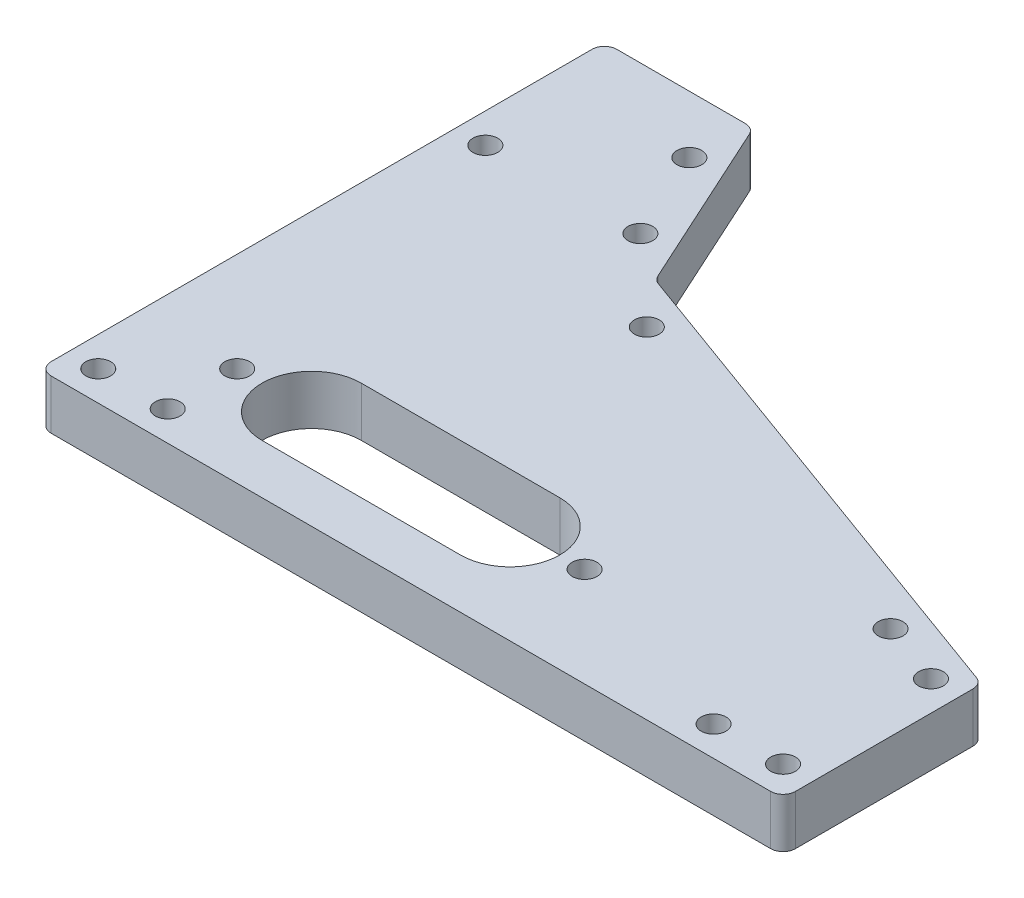
ISO-10303-21;
HEADER;
FILE_DESCRIPTION(('STEP AP214'),'2;1');
FILE_NAME('part.step','',(''),(''),'','','');
FILE_SCHEMA(('AUTOMOTIVE_DESIGN { 1 0 10303 214 1 1 1 1 }'));
ENDSEC;
DATA;
#1=APPLICATION_CONTEXT('core data for automotive mechanical design processes');
#2=APPLICATION_PROTOCOL_DEFINITION('international standard','automotive_design',2000,#1);
#3=PRODUCT_CONTEXT('',#1,'mechanical');
#4=PRODUCT('Part','Part','',(#3));
#5=PRODUCT_RELATED_PRODUCT_CATEGORY('part','',(#4));
#6=PRODUCT_DEFINITION_FORMATION('','',#4);
#7=PRODUCT_DEFINITION_CONTEXT('part definition',#1,'design');
#8=PRODUCT_DEFINITION('design','',#6,#7);
#9=PRODUCT_DEFINITION_SHAPE('','',#8);
#10=(LENGTH_UNIT() NAMED_UNIT(*) SI_UNIT(.MILLI.,.METRE.));
#11=(NAMED_UNIT(*) PLANE_ANGLE_UNIT() SI_UNIT($,.RADIAN.));
#12=(NAMED_UNIT(*) SI_UNIT($,.STERADIAN.) SOLID_ANGLE_UNIT());
#13=UNCERTAINTY_MEASURE_WITH_UNIT(LENGTH_MEASURE(1.E-05),#10,'distance_accuracy_value','');
#14=(GEOMETRIC_REPRESENTATION_CONTEXT(3) GLOBAL_UNCERTAINTY_ASSIGNED_CONTEXT((#13)) GLOBAL_UNIT_ASSIGNED_CONTEXT((#10,
#11,#12)) REPRESENTATION_CONTEXT('',''));
#15=CARTESIAN_POINT('',(0.,0.,0.));
#16=DIRECTION('',(0.,0.,1.));
#17=DIRECTION('',(1.,0.,0.));
#18=AXIS2_PLACEMENT_3D('',#15,#16,#17);
#19=CARTESIAN_POINT('',(0.,12.7,0.));
#20=DIRECTION('',(0.,-1.,0.));
#21=DIRECTION('',(0.,0.,-1.));
#22=AXIS2_PLACEMENT_3D('',#19,#20,#21);
#23=PLANE('',#22);
#24=CARTESIAN_POINT('',(165.1,12.7,-7.62));
#25=DIRECTION('',(0.,1.,0.));
#26=DIRECTION('',(0.,0.,1.));
#27=AXIS2_PLACEMENT_3D('',#24,#25,#26);
#28=CIRCLE('',#27,3.175);
#29=CARTESIAN_POINT('',(165.1,12.7,-4.445));
#30=VERTEX_POINT('',#29);
#31=EDGE_CURVE('E217',#30,#30,#28,.T.);
#32=ORIENTED_EDGE('',*,*,#31,.F.);
#33=EDGE_LOOP('',(#32));
#34=FACE_BOUND('',#33,.T.);
#35=CARTESIAN_POINT('',(25.4,12.7,-7.61999999999996));
#36=DIRECTION('',(0.,1.,0.));
#37=DIRECTION('',(0.,0.,1.));
#38=AXIS2_PLACEMENT_3D('',#35,#36,#37);
#39=CIRCLE('',#38,3.175);
#40=CARTESIAN_POINT('',(25.4,12.7,-4.44499999999996));
#41=VERTEX_POINT('',#40);
#42=EDGE_CURVE('E225',#41,#41,#39,.T.);
#43=ORIENTED_EDGE('',*,*,#42,.F.);
#44=EDGE_LOOP('',(#43));
#45=FACE_BOUND('',#44,.T.);
#46=CARTESIAN_POINT('',(7.62,12.7,-7.61999999999998));
#47=DIRECTION('',(0.,1.,0.));
#48=DIRECTION('',(0.,0.,1.));
#49=AXIS2_PLACEMENT_3D('',#46,#47,#48);
#50=CIRCLE('',#49,3.175);
#51=CARTESIAN_POINT('',(7.62,12.7,-4.44499999999998));
#52=VERTEX_POINT('',#51);
#53=EDGE_CURVE('E233',#52,#52,#50,.T.);
#54=ORIENTED_EDGE('',*,*,#53,.F.);
#55=EDGE_LOOP('',(#54));
#56=FACE_BOUND('',#55,.T.);
#57=CARTESIAN_POINT('',(7.62,12.7,-106.679530824651));
#58=DIRECTION('',(0.,1.,0.));
#59=DIRECTION('',(0.,0.,1.));
#60=AXIS2_PLACEMENT_3D('',#57,#58,#59);
#61=CIRCLE('',#60,3.175);
#62=CARTESIAN_POINT('',(7.62,12.7,-103.504530824651));
#63=VERTEX_POINT('',#62);
#64=EDGE_CURVE('E241',#63,#63,#61,.T.);
#65=ORIENTED_EDGE('',*,*,#64,.F.);
#66=EDGE_LOOP('',(#65));
#67=FACE_BOUND('',#66,.T.);
#68=CARTESIAN_POINT('',(182.88,12.7,-7.62));
#69=DIRECTION('',(0.,1.,0.));
#70=DIRECTION('',(0.,0.,1.));
#71=AXIS2_PLACEMENT_3D('',#68,#69,#70);
#72=CIRCLE('',#71,3.175);
#73=CARTESIAN_POINT('',(182.88,12.7,-4.445));
#74=VERTEX_POINT('',#73);
#75=EDGE_CURVE('E249',#74,#74,#72,.T.);
#76=ORIENTED_EDGE('',*,*,#75,.F.);
#77=EDGE_LOOP('',(#76));
#78=FACE_BOUND('',#77,.T.);
#79=CARTESIAN_POINT('',(47.013808136848,12.7,-106.961302091678));
#80=DIRECTION('',(0.,1.,0.));
#81=DIRECTION('',(0.,0.,1.));
#82=AXIS2_PLACEMENT_3D('',#79,#80,#81);
#83=CIRCLE('',#82,3.175);
#84=CARTESIAN_POINT('',(47.013808136848,12.7,-103.786302091678));
#85=VERTEX_POINT('',#84);
#86=EDGE_CURVE('E257',#85,#85,#83,.T.);
#87=ORIENTED_EDGE('',*,*,#86,.F.);
#88=EDGE_LOOP('',(#87));
#89=FACE_BOUND('',#88,.T.);
#90=CARTESIAN_POINT('',(68.552843668048,12.7,-87.0761004319709));
#91=DIRECTION('',(0.,1.,0.));
#92=DIRECTION('',(0.,0.,1.));
#93=AXIS2_PLACEMENT_3D('',#90,#91,#92);
#94=CIRCLE('',#93,3.175);
#95=CARTESIAN_POINT('',(68.552843668048,12.7,-83.9011004319709));
#96=VERTEX_POINT('',#95);
#97=EDGE_CURVE('E265',#96,#96,#94,.T.);
#98=ORIENTED_EDGE('',*,*,#97,.F.);
#99=EDGE_LOOP('',(#98));
#100=FACE_BOUND('',#99,.T.);
#101=CARTESIAN_POINT('',(182.88,12.7,-45.464418558842));
#102=DIRECTION('',(0.,1.,0.));
#103=DIRECTION('',(0.,0.,1.));
#104=AXIS2_PLACEMENT_3D('',#101,#102,#103);
#105=CIRCLE('',#104,3.175);
#106=CARTESIAN_POINT('',(182.88,12.7,-42.289418558842));
#107=VERTEX_POINT('',#106);
#108=EDGE_CURVE('E273',#107,#107,#105,.T.);
#109=ORIENTED_EDGE('',*,*,#108,.F.);
#110=EDGE_LOOP('',(#109));
#111=FACE_BOUND('',#110,.T.);
#112=CARTESIAN_POINT('',(36.4513376987438,12.7,-130.060960492706));
#113=DIRECTION('',(0.,1.,0.));
#114=DIRECTION('',(0.,0.,1.));
#115=AXIS2_PLACEMENT_3D('',#112,#113,#114);
#116=CIRCLE('',#115,3.175);
#117=CARTESIAN_POINT('',(36.4513376987438,12.7,-126.885960492706));
#118=VERTEX_POINT('',#117);
#119=EDGE_CURVE('E281',#118,#118,#116,.T.);
#120=ORIENTED_EDGE('',*,*,#119,.F.);
#121=EDGE_LOOP('',(#120));
#122=FACE_BOUND('',#121,.T.);
#123=CARTESIAN_POINT('',(166.631807432038,12.7,-51.3782770142055));
#124=DIRECTION('',(0.,1.,0.));
#125=DIRECTION('',(0.,0.,1.));
#126=AXIS2_PLACEMENT_3D('',#123,#124,#125);
#127=CIRCLE('',#126,3.175);
#128=CARTESIAN_POINT('',(166.631807432038,12.7,-48.2032770142055));
#129=VERTEX_POINT('',#128);
#130=EDGE_CURVE('E289',#129,#129,#127,.T.);
#131=ORIENTED_EDGE('',*,*,#130,.F.);
#132=EDGE_LOOP('',(#131));
#133=FACE_BOUND('',#132,.T.);
#134=DIRECTION('',(0.,0.,1.));
#135=VECTOR('',#134,1.);
#136=CARTESIAN_POINT('',(0.,12.7,0.));
#137=LINE('',#136,#135);
#138=CARTESIAN_POINT('',(0.,12.7,-141.604530824651));
#139=VERTEX_POINT('',#138);
#140=CARTESIAN_POINT('',(0.,12.7,-3.175));
#141=VERTEX_POINT('',#140);
#142=EDGE_CURVE('E297',#139,#141,#137,.T.);
#143=ORIENTED_EDGE('',*,*,#142,.T.);
#144=CARTESIAN_POINT('',(3.17500000000001,12.7,-3.175));
#145=DIRECTION('',(0.,-1.,0.));
#146=DIRECTION('',(0.,0.,-1.));
#147=AXIS2_PLACEMENT_3D('',#144,#145,#146);
#148=CIRCLE('',#147,3.175);
#149=CARTESIAN_POINT('',(3.17500000000001,12.7,0.));
#150=VERTEX_POINT('',#149);
#151=EDGE_CURVE('E381',#141,#150,#148,.F.);
#152=ORIENTED_EDGE('',*,*,#151,.T.);
#153=DIRECTION('',(1.,0.,0.));
#154=VECTOR('',#153,1.);
#155=CARTESIAN_POINT('',(190.5,12.7,0.));
#156=LINE('',#155,#154);
#157=CARTESIAN_POINT('',(187.325,12.7,0.));
#158=VERTEX_POINT('',#157);
#159=EDGE_CURVE('E301',#150,#158,#156,.T.);
#160=ORIENTED_EDGE('',*,*,#159,.T.);
#161=CARTESIAN_POINT('',(187.325,12.7,-3.175));
#162=DIRECTION('',(0.,-1.,0.));
#163=DIRECTION('',(0.,0.,-1.));
#164=AXIS2_PLACEMENT_3D('',#161,#162,#163);
#165=CIRCLE('',#164,3.175);
#166=CARTESIAN_POINT('',(190.5,12.7,-3.175));
#167=VERTEX_POINT('',#166);
#168=EDGE_CURVE('E378',#158,#167,#165,.F.);
#169=ORIENTED_EDGE('',*,*,#168,.T.);
#170=DIRECTION('',(0.,0.,-1.));
#171=VECTOR('',#170,1.);
#172=CARTESIAN_POINT('',(190.5,12.7,-50.8));
#173=LINE('',#172,#171);
#174=CARTESIAN_POINT('',(190.5,12.7,-48.5768410661842));
#175=VERTEX_POINT('',#174);
#176=EDGE_CURVE('E306',#167,#175,#173,.T.);
#177=ORIENTED_EDGE('',*,*,#176,.T.);
#178=CARTESIAN_POINT('',(187.325,12.7,-48.5768410661842));
#179=DIRECTION('',(0.,-1.,0.));
#180=DIRECTION('',(0.,0.,-1.));
#181=AXIS2_PLACEMENT_3D('',#178,#179,#180);
#182=CIRCLE('',#181,3.175);
#183=CARTESIAN_POINT('',(188.410913955059,12.7,-51.5603651371794));
#184=VERTEX_POINT('',#183);
#185=EDGE_CURVE('E375',#175,#184,#182,.F.);
#186=ORIENTED_EDGE('',*,*,#185,.T.);
#187=DIRECTION('',(-0.93969262078591,0.,-0.342020143325665));
#188=VECTOR('',#187,1.);
#189=CARTESIAN_POINT('',(59.2249408762084,12.7,-98.5802140225955));
#190=LINE('',#189,#188);
#191=CARTESIAN_POINT('',(60.4738155630558,12.7,-98.1256608102545));
#192=VERTEX_POINT('',#191);
#193=EDGE_CURVE('E310',#184,#192,#190,.T.);
#194=ORIENTED_EDGE('',*,*,#193,.T.);
#195=CARTESIAN_POINT('',(61.5597295181148,12.7,-101.10918488125));
#196=DIRECTION('',(0.,-1.,0.));
#197=DIRECTION('',(0.,0.,-1.));
#198=AXIS2_PLACEMENT_3D('',#195,#196,#197);
#199=CIRCLE('',#198,3.175);
#200=CARTESIAN_POINT('',(58.6722722179863,12.7,-99.7888760764867));
#201=VERTEX_POINT('',#200);
#202=EDGE_CURVE('E11',#192,#201,#199,.T.);
#203=ORIENTED_EDGE('',*,*,#202,.T.);
#204=DIRECTION('',(-0.415845292838749,0.,-0.909435370119205));
#205=VECTOR('',#204,1.);
#206=CARTESIAN_POINT('',(38.1,12.7,-144.779530824651));
#207=LINE('',#206,#205);
#208=CARTESIAN_POINT('',(38.9480697238636,12.7,-142.924839629414));
#209=VERTEX_POINT('',#208);
#210=EDGE_CURVE('E314',#201,#209,#207,.T.);
#211=ORIENTED_EDGE('',*,*,#210,.T.);
#212=CARTESIAN_POINT('',(36.0606124237351,12.7,-141.604530824651));
#213=DIRECTION('',(0.,-1.,0.));
#214=DIRECTION('',(0.,0.,-1.));
#215=AXIS2_PLACEMENT_3D('',#212,#213,#214);
#216=CIRCLE('',#215,3.175);
#217=CARTESIAN_POINT('',(36.0606124237351,12.7,-144.779530824651));
#218=VERTEX_POINT('',#217);
#219=EDGE_CURVE('E68',#209,#218,#216,.F.);
#220=ORIENTED_EDGE('',*,*,#219,.T.);
#221=DIRECTION('',(-1.,0.,0.));
#222=VECTOR('',#221,1.);
#223=CARTESIAN_POINT('',(0.,12.7,-144.779530824651));
#224=LINE('',#223,#222);
#225=CARTESIAN_POINT('',(3.175,12.7,-144.779530824651));
#226=VERTEX_POINT('',#225);
#227=EDGE_CURVE('E317',#218,#226,#224,.T.);
#228=ORIENTED_EDGE('',*,*,#227,.T.);
#229=CARTESIAN_POINT('',(3.175,12.7,-141.604530824651));
#230=DIRECTION('',(0.,-1.,0.));
#231=DIRECTION('',(0.,0.,-1.));
#232=AXIS2_PLACEMENT_3D('',#229,#230,#231);
#233=CIRCLE('',#232,3.175);
#234=EDGE_CURVE('E370',#226,#139,#233,.F.);
#235=ORIENTED_EDGE('',*,*,#234,.T.);
#236=EDGE_LOOP('',(#143,#152,#160,#169,#177,#186,#194,#203,#211,#220,#228,#235));
#237=FACE_BOUND('',#236,.T.);
#238=CARTESIAN_POINT('',(95.25,12.7,-25.4));
#239=DIRECTION('',(0.,1.,0.));
#240=DIRECTION('',(0.,0.,1.));
#241=AXIS2_PLACEMENT_3D('',#238,#239,#240);
#242=CIRCLE('',#241,12.7);
#243=CARTESIAN_POINT('',(95.25,12.7,-12.7));
#244=VERTEX_POINT('',#243);
#245=CARTESIAN_POINT('',(95.25,12.7,-38.1));
#246=VERTEX_POINT('',#245);
#247=EDGE_CURVE('E161',#244,#246,#242,.T.);
#248=ORIENTED_EDGE('',*,*,#247,.F.);
#249=DIRECTION('',(1.,0.,0.));
#250=VECTOR('',#249,1.);
#251=CARTESIAN_POINT('',(95.25,12.7,-12.7));
#252=LINE('',#251,#250);
#253=CARTESIAN_POINT('',(44.45,12.7,-12.7));
#254=VERTEX_POINT('',#253);
#255=EDGE_CURVE('E191',#254,#244,#252,.T.);
#256=ORIENTED_EDGE('',*,*,#255,.F.);
#257=CARTESIAN_POINT('',(44.45,12.7,-25.4));
#258=DIRECTION('',(0.,1.,0.));
#259=DIRECTION('',(0.,0.,1.));
#260=AXIS2_PLACEMENT_3D('',#257,#258,#259);
#261=CIRCLE('',#260,12.7);
#262=CARTESIAN_POINT('',(44.45,12.7,-38.1));
#263=VERTEX_POINT('',#262);
#264=EDGE_CURVE('E187',#263,#254,#261,.T.);
#265=ORIENTED_EDGE('',*,*,#264,.F.);
#266=DIRECTION('',(-1.,0.,0.));
#267=VECTOR('',#266,1.);
#268=CARTESIAN_POINT('',(95.25,12.7,-38.1));
#269=LINE('',#268,#267);
#270=EDGE_CURVE('E172',#246,#263,#269,.T.);
#271=ORIENTED_EDGE('',*,*,#270,.F.);
#272=EDGE_LOOP('',(#248,#256,#265,#271));
#273=FACE_BOUND('',#272,.T.);
#274=CARTESIAN_POINT('',(25.4,12.7,-25.4));
#275=DIRECTION('',(0.,1.,0.));
#276=DIRECTION('',(0.,0.,1.));
#277=AXIS2_PLACEMENT_3D('',#274,#275,#276);
#278=CIRCLE('',#277,3.175);
#279=CARTESIAN_POINT('',(25.4,12.7,-22.225));
#280=VERTEX_POINT('',#279);
#281=EDGE_CURVE('E200',#280,#280,#278,.T.);
#282=ORIENTED_EDGE('',*,*,#281,.F.);
#283=EDGE_LOOP('',(#282));
#284=FACE_BOUND('',#283,.T.);
#285=CARTESIAN_POINT('',(114.3,12.7,-25.4));
#286=DIRECTION('',(0.,1.,0.));
#287=DIRECTION('',(0.,0.,1.));
#288=AXIS2_PLACEMENT_3D('',#285,#286,#287);
#289=CIRCLE('',#288,3.175);
#290=CARTESIAN_POINT('',(114.3,12.7,-22.225));
#291=VERTEX_POINT('',#290);
#292=EDGE_CURVE('E581',#291,#291,#289,.T.);
#293=ORIENTED_EDGE('',*,*,#292,.F.);
#294=EDGE_LOOP('',(#293));
#295=FACE_BOUND('',#294,.T.);
#296=ADVANCED_FACE('F45',(#34,#45,#56,#67,#78,#89,#100,#111,#122,#133,#237,#273,#284,#295),#23,.F.);
#297=CARTESIAN_POINT('',(0.,0.,0.));
#298=DIRECTION('',(0.,-1.,0.));
#299=DIRECTION('',(0.,0.,-1.));
#300=AXIS2_PLACEMENT_3D('',#297,#298,#299);
#301=PLANE('',#300);
#302=CARTESIAN_POINT('',(25.4,0.,-25.4));
#303=DIRECTION('',(0.,1.,0.));
#304=DIRECTION('',(0.,0.,1.));
#305=AXIS2_PLACEMENT_3D('',#302,#303,#304);
#306=CIRCLE('',#305,3.175);
#307=CARTESIAN_POINT('',(25.4,0.,-22.225));
#308=VERTEX_POINT('',#307);
#309=EDGE_CURVE('E584',#308,#308,#306,.T.);
#310=ORIENTED_EDGE('',*,*,#309,.T.);
#311=EDGE_LOOP('',(#310));
#312=FACE_BOUND('',#311,.T.);
#313=CARTESIAN_POINT('',(25.4,0.,-7.61999999999996));
#314=DIRECTION('',(0.,1.,0.));
#315=DIRECTION('',(0.,0.,1.));
#316=AXIS2_PLACEMENT_3D('',#313,#314,#315);
#317=CIRCLE('',#316,3.175);
#318=CARTESIAN_POINT('',(25.4,0.,-4.44499999999996));
#319=VERTEX_POINT('',#318);
#320=EDGE_CURVE('E221',#319,#319,#317,.T.);
#321=ORIENTED_EDGE('',*,*,#320,.T.);
#322=EDGE_LOOP('',(#321));
#323=FACE_BOUND('',#322,.T.);
#324=CARTESIAN_POINT('',(7.62,0.,-106.679530824651));
#325=DIRECTION('',(0.,1.,0.));
#326=DIRECTION('',(0.,0.,1.));
#327=AXIS2_PLACEMENT_3D('',#324,#325,#326);
#328=CIRCLE('',#327,3.175);
#329=CARTESIAN_POINT('',(7.62,0.,-103.504530824651));
#330=VERTEX_POINT('',#329);
#331=EDGE_CURVE('E237',#330,#330,#328,.T.);
#332=ORIENTED_EDGE('',*,*,#331,.T.);
#333=EDGE_LOOP('',(#332));
#334=FACE_BOUND('',#333,.T.);
#335=CARTESIAN_POINT('',(47.013808136848,0.,-106.961302091678));
#336=DIRECTION('',(0.,1.,0.));
#337=DIRECTION('',(0.,0.,1.));
#338=AXIS2_PLACEMENT_3D('',#335,#336,#337);
#339=CIRCLE('',#338,3.175);
#340=CARTESIAN_POINT('',(47.013808136848,0.,-103.786302091678));
#341=VERTEX_POINT('',#340);
#342=EDGE_CURVE('E253',#341,#341,#339,.T.);
#343=ORIENTED_EDGE('',*,*,#342,.T.);
#344=EDGE_LOOP('',(#343));
#345=FACE_BOUND('',#344,.T.);
#346=CARTESIAN_POINT('',(182.88,0.,-45.464418558842));
#347=DIRECTION('',(0.,1.,0.));
#348=DIRECTION('',(0.,0.,1.));
#349=AXIS2_PLACEMENT_3D('',#346,#347,#348);
#350=CIRCLE('',#349,3.175);
#351=CARTESIAN_POINT('',(182.88,0.,-42.289418558842));
#352=VERTEX_POINT('',#351);
#353=EDGE_CURVE('E269',#352,#352,#350,.T.);
#354=ORIENTED_EDGE('',*,*,#353,.T.);
#355=EDGE_LOOP('',(#354));
#356=FACE_BOUND('',#355,.T.);
#357=CARTESIAN_POINT('',(166.631807432038,0.,-51.3782770142055));
#358=DIRECTION('',(0.,1.,0.));
#359=DIRECTION('',(0.,0.,1.));
#360=AXIS2_PLACEMENT_3D('',#357,#358,#359);
#361=CIRCLE('',#360,3.175);
#362=CARTESIAN_POINT('',(166.631807432038,0.,-48.2032770142055));
#363=VERTEX_POINT('',#362);
#364=EDGE_CURVE('E285',#363,#363,#361,.T.);
#365=ORIENTED_EDGE('',*,*,#364,.T.);
#366=EDGE_LOOP('',(#365));
#367=FACE_BOUND('',#366,.T.);
#368=DIRECTION('',(1.,0.,0.));
#369=VECTOR('',#368,1.);
#370=CARTESIAN_POINT('',(190.5,0.,0.));
#371=LINE('',#370,#369);
#372=CARTESIAN_POINT('',(3.17500000000001,0.,0.));
#373=VERTEX_POINT('',#372);
#374=CARTESIAN_POINT('',(187.325,0.,0.));
#375=VERTEX_POINT('',#374);
#376=EDGE_CURVE('E324',#373,#375,#371,.T.);
#377=ORIENTED_EDGE('',*,*,#376,.F.);
#378=CARTESIAN_POINT('',(3.17500000000001,0.,-3.175));
#379=DIRECTION('',(0.,-1.,0.));
#380=DIRECTION('',(0.,0.,-1.));
#381=AXIS2_PLACEMENT_3D('',#378,#379,#380);
#382=CIRCLE('',#381,3.175);
#383=CARTESIAN_POINT('',(0.,0.,-3.175));
#384=VERTEX_POINT('',#383);
#385=EDGE_CURVE('E360',#373,#384,#382,.T.);
#386=ORIENTED_EDGE('',*,*,#385,.T.);
#387=DIRECTION('',(0.,0.,1.));
#388=VECTOR('',#387,1.);
#389=CARTESIAN_POINT('',(0.,0.,0.));
#390=LINE('',#389,#388);
#391=CARTESIAN_POINT('',(0.,0.,-141.604530824651));
#392=VERTEX_POINT('',#391);
#393=EDGE_CURVE('E293',#392,#384,#390,.T.);
#394=ORIENTED_EDGE('',*,*,#393,.F.);
#395=CARTESIAN_POINT('',(3.175,0.,-141.604530824651));
#396=DIRECTION('',(0.,-1.,0.));
#397=DIRECTION('',(0.,0.,-1.));
#398=AXIS2_PLACEMENT_3D('',#395,#396,#397);
#399=CIRCLE('',#398,3.175);
#400=CARTESIAN_POINT('',(3.175,0.,-144.779530824651));
#401=VERTEX_POINT('',#400);
#402=EDGE_CURVE('E348',#392,#401,#399,.T.);
#403=ORIENTED_EDGE('',*,*,#402,.T.);
#404=DIRECTION('',(-1.,0.,0.));
#405=VECTOR('',#404,1.);
#406=CARTESIAN_POINT('',(0.,0.,-144.779530824651));
#407=LINE('',#406,#405);
#408=CARTESIAN_POINT('',(36.0606124237351,0.,-144.779530824651));
#409=VERTEX_POINT('',#408);
#410=EDGE_CURVE('E302',#409,#401,#407,.T.);
#411=ORIENTED_EDGE('',*,*,#410,.F.);
#412=CARTESIAN_POINT('',(36.0606124237351,0.,-141.604530824651));
#413=DIRECTION('',(0.,-1.,0.));
#414=DIRECTION('',(0.,0.,-1.));
#415=AXIS2_PLACEMENT_3D('',#412,#413,#414);
#416=CIRCLE('',#415,3.175);
#417=CARTESIAN_POINT('',(38.9480697238636,0.,-142.924839629414));
#418=VERTEX_POINT('',#417);
#419=EDGE_CURVE('E351',#409,#418,#416,.T.);
#420=ORIENTED_EDGE('',*,*,#419,.T.);
#421=DIRECTION('',(-0.415845292838749,0.,-0.909435370119205));
#422=VECTOR('',#421,1.);
#423=CARTESIAN_POINT('',(38.1,0.,-144.779530824651));
#424=LINE('',#423,#422);
#425=CARTESIAN_POINT('',(58.6722722179863,0.,-99.7888760764867));
#426=VERTEX_POINT('',#425);
#427=EDGE_CURVE('E336',#426,#418,#424,.T.);
#428=ORIENTED_EDGE('',*,*,#427,.F.);
#429=CARTESIAN_POINT('',(61.5597295181148,0.,-101.10918488125));
#430=DIRECTION('',(0.,-1.,0.));
#431=DIRECTION('',(0.,0.,-1.));
#432=AXIS2_PLACEMENT_3D('',#429,#430,#431);
#433=CIRCLE('',#432,3.175);
#434=CARTESIAN_POINT('',(60.4738155630558,0.,-98.1256608102545));
#435=VERTEX_POINT('',#434);
#436=EDGE_CURVE('E54',#426,#435,#433,.F.);
#437=ORIENTED_EDGE('',*,*,#436,.T.);
#438=DIRECTION('',(-0.93969262078591,0.,-0.342020143325665));
#439=VECTOR('',#438,1.);
#440=CARTESIAN_POINT('',(59.2249408762084,0.,-98.5802140225955));
#441=LINE('',#440,#439);
#442=CARTESIAN_POINT('',(188.410913955059,0.,-51.5603651371794));
#443=VERTEX_POINT('',#442);
#444=EDGE_CURVE('E332',#443,#435,#441,.T.);
#445=ORIENTED_EDGE('',*,*,#444,.F.);
#446=CARTESIAN_POINT('',(187.325,0.,-48.5768410661842));
#447=DIRECTION('',(0.,-1.,0.));
#448=DIRECTION('',(0.,0.,-1.));
#449=AXIS2_PLACEMENT_3D('',#446,#447,#448);
#450=CIRCLE('',#449,3.175);
#451=CARTESIAN_POINT('',(190.5,0.,-48.5768410661842));
#452=VERTEX_POINT('',#451);
#453=EDGE_CURVE('E354',#443,#452,#450,.T.);
#454=ORIENTED_EDGE('',*,*,#453,.T.);
#455=DIRECTION('',(0.,0.,-1.));
#456=VECTOR('',#455,1.);
#457=CARTESIAN_POINT('',(190.5,0.,-50.8));
#458=LINE('',#457,#456);
#459=CARTESIAN_POINT('',(190.5,0.,-3.175));
#460=VERTEX_POINT('',#459);
#461=EDGE_CURVE('E328',#460,#452,#458,.T.);
#462=ORIENTED_EDGE('',*,*,#461,.F.);
#463=CARTESIAN_POINT('',(187.325,0.,-3.175));
#464=DIRECTION('',(0.,-1.,0.));
#465=DIRECTION('',(0.,0.,-1.));
#466=AXIS2_PLACEMENT_3D('',#463,#464,#465);
#467=CIRCLE('',#466,3.175);
#468=EDGE_CURVE('E357',#460,#375,#467,.T.);
#469=ORIENTED_EDGE('',*,*,#468,.T.);
#470=EDGE_LOOP('',(#377,#386,#394,#403,#411,#420,#428,#437,#445,#454,#462,#469));
#471=FACE_BOUND('',#470,.T.);
#472=CARTESIAN_POINT('',(36.4513376987438,0.,-130.060960492706));
#473=DIRECTION('',(0.,1.,0.));
#474=DIRECTION('',(0.,0.,1.));
#475=AXIS2_PLACEMENT_3D('',#472,#473,#474);
#476=CIRCLE('',#475,3.175);
#477=CARTESIAN_POINT('',(36.4513376987438,0.,-126.885960492706));
#478=VERTEX_POINT('',#477);
#479=EDGE_CURVE('E277',#478,#478,#476,.T.);
#480=ORIENTED_EDGE('',*,*,#479,.T.);
#481=EDGE_LOOP('',(#480));
#482=FACE_BOUND('',#481,.T.);
#483=CARTESIAN_POINT('',(68.552843668048,0.,-87.0761004319709));
#484=DIRECTION('',(0.,1.,0.));
#485=DIRECTION('',(0.,0.,1.));
#486=AXIS2_PLACEMENT_3D('',#483,#484,#485);
#487=CIRCLE('',#486,3.175);
#488=CARTESIAN_POINT('',(68.552843668048,0.,-83.9011004319709));
#489=VERTEX_POINT('',#488);
#490=EDGE_CURVE('E261',#489,#489,#487,.T.);
#491=ORIENTED_EDGE('',*,*,#490,.T.);
#492=EDGE_LOOP('',(#491));
#493=FACE_BOUND('',#492,.T.);
#494=CARTESIAN_POINT('',(182.88,0.,-7.62));
#495=DIRECTION('',(0.,1.,0.));
#496=DIRECTION('',(0.,0.,1.));
#497=AXIS2_PLACEMENT_3D('',#494,#495,#496);
#498=CIRCLE('',#497,3.175);
#499=CARTESIAN_POINT('',(182.88,0.,-4.445));
#500=VERTEX_POINT('',#499);
#501=EDGE_CURVE('E245',#500,#500,#498,.T.);
#502=ORIENTED_EDGE('',*,*,#501,.T.);
#503=EDGE_LOOP('',(#502));
#504=FACE_BOUND('',#503,.T.);
#505=CARTESIAN_POINT('',(7.62,0.,-7.61999999999998));
#506=DIRECTION('',(0.,1.,0.));
#507=DIRECTION('',(0.,0.,1.));
#508=AXIS2_PLACEMENT_3D('',#505,#506,#507);
#509=CIRCLE('',#508,3.175);
#510=CARTESIAN_POINT('',(7.62,0.,-4.44499999999998));
#511=VERTEX_POINT('',#510);
#512=EDGE_CURVE('E229',#511,#511,#509,.T.);
#513=ORIENTED_EDGE('',*,*,#512,.T.);
#514=EDGE_LOOP('',(#513));
#515=FACE_BOUND('',#514,.T.);
#516=CARTESIAN_POINT('',(165.1,0.,-7.62));
#517=DIRECTION('',(0.,1.,0.));
#518=DIRECTION('',(0.,0.,1.));
#519=AXIS2_PLACEMENT_3D('',#516,#517,#518);
#520=CIRCLE('',#519,3.175);
#521=CARTESIAN_POINT('',(165.1,0.,-4.445));
#522=VERTEX_POINT('',#521);
#523=EDGE_CURVE('E181',#522,#522,#520,.T.);
#524=ORIENTED_EDGE('',*,*,#523,.T.);
#525=EDGE_LOOP('',(#524));
#526=FACE_BOUND('',#525,.T.);
#527=DIRECTION('',(1.,0.,0.));
#528=VECTOR('',#527,1.);
#529=CARTESIAN_POINT('',(95.25,0.,-12.7));
#530=LINE('',#529,#528);
#531=CARTESIAN_POINT('',(44.45,0.,-12.7));
#532=VERTEX_POINT('',#531);
#533=CARTESIAN_POINT('',(95.25,0.,-12.7));
#534=VERTEX_POINT('',#533);
#535=EDGE_CURVE('E173',#532,#534,#530,.T.);
#536=ORIENTED_EDGE('',*,*,#535,.T.);
#537=CARTESIAN_POINT('',(95.25,0.,-25.4));
#538=DIRECTION('',(0.,1.,0.));
#539=DIRECTION('',(0.,0.,1.));
#540=AXIS2_PLACEMENT_3D('',#537,#538,#539);
#541=CIRCLE('',#540,12.7);
#542=CARTESIAN_POINT('',(95.25,0.,-38.1));
#543=VERTEX_POINT('',#542);
#544=EDGE_CURVE('E197',#534,#543,#541,.T.);
#545=ORIENTED_EDGE('',*,*,#544,.T.);
#546=DIRECTION('',(-1.,0.,0.));
#547=VECTOR('',#546,1.);
#548=CARTESIAN_POINT('',(95.25,0.,-38.1));
#549=LINE('',#548,#547);
#550=CARTESIAN_POINT('',(44.45,0.,-38.1));
#551=VERTEX_POINT('',#550);
#552=EDGE_CURVE('E179',#543,#551,#549,.T.);
#553=ORIENTED_EDGE('',*,*,#552,.T.);
#554=CARTESIAN_POINT('',(44.45,0.,-25.4));
#555=DIRECTION('',(0.,1.,0.));
#556=DIRECTION('',(0.,0.,1.));
#557=AXIS2_PLACEMENT_3D('',#554,#555,#556);
#558=CIRCLE('',#557,12.7);
#559=EDGE_CURVE('E203',#551,#532,#558,.T.);
#560=ORIENTED_EDGE('',*,*,#559,.T.);
#561=EDGE_LOOP('',(#536,#545,#553,#560));
#562=FACE_BOUND('',#561,.T.);
#563=CARTESIAN_POINT('',(114.3,0.,-25.4));
#564=DIRECTION('',(0.,1.,0.));
#565=DIRECTION('',(0.,0.,1.));
#566=AXIS2_PLACEMENT_3D('',#563,#564,#565);
#567=CIRCLE('',#566,3.175);
#568=CARTESIAN_POINT('',(114.3,0.,-22.225));
#569=VERTEX_POINT('',#568);
#570=EDGE_CURVE('E579',#569,#569,#567,.T.);
#571=ORIENTED_EDGE('',*,*,#570,.T.);
#572=EDGE_LOOP('',(#571));
#573=FACE_BOUND('',#572,.T.);
#574=ADVANCED_FACE('F415',(#312,#323,#334,#345,#356,#367,#471,#482,#493,#504,#515,#526,#562,
#573),#301,.T.);
#575=CARTESIAN_POINT('',(0.,12.7,0.));
#576=DIRECTION('',(1.,0.,0.));
#577=DIRECTION('',(0.,0.,-1.));
#578=AXIS2_PLACEMENT_3D('',#575,#576,#577);
#579=PLANE('',#578);
#580=ORIENTED_EDGE('',*,*,#393,.T.);
#581=DIRECTION('',(0.,-1.,0.));
#582=VECTOR('',#581,1.);
#583=CARTESIAN_POINT('',(0.,12.7,-3.175));
#584=LINE('',#583,#582);
#585=EDGE_CURVE('E367',#384,#141,#584,.F.);
#586=ORIENTED_EDGE('',*,*,#585,.T.);
#587=ORIENTED_EDGE('',*,*,#142,.F.);
#588=DIRECTION('',(0.,-1.,0.));
#589=VECTOR('',#588,1.);
#590=CARTESIAN_POINT('',(0.,12.7,-141.604530824651));
#591=LINE('',#590,#589);
#592=EDGE_CURVE('E363',#139,#392,#591,.T.);
#593=ORIENTED_EDGE('',*,*,#592,.T.);
#594=EDGE_LOOP('',(#580,#586,#587,#593));
#595=FACE_BOUND('',#594,.T.);
#596=ADVANCED_FACE('F441',(#595),#579,.F.);
#597=CARTESIAN_POINT('',(190.5,12.7,0.));
#598=DIRECTION('',(0.,0.,-1.));
#599=DIRECTION('',(-1.,0.,0.));
#600=AXIS2_PLACEMENT_3D('',#597,#598,#599);
#601=PLANE('',#600);
#602=ORIENTED_EDGE('',*,*,#159,.F.);
#603=DIRECTION('',(0.,-1.,0.));
#604=VECTOR('',#603,1.);
#605=CARTESIAN_POINT('',(3.17500000000001,12.7,0.));
#606=LINE('',#605,#604);
#607=EDGE_CURVE('E344',#150,#373,#606,.T.);
#608=ORIENTED_EDGE('',*,*,#607,.T.);
#609=ORIENTED_EDGE('',*,*,#376,.T.);
#610=DIRECTION('',(0.,-1.,0.));
#611=VECTOR('',#610,1.);
#612=CARTESIAN_POINT('',(187.325,12.7,0.));
#613=LINE('',#612,#611);
#614=EDGE_CURVE('E320',#375,#158,#613,.F.);
#615=ORIENTED_EDGE('',*,*,#614,.T.);
#616=EDGE_LOOP('',(#602,#608,#609,#615));
#617=FACE_BOUND('',#616,.T.);
#618=ADVANCED_FACE('F449',(#617),#601,.F.);
#619=CARTESIAN_POINT('',(190.5,12.7,-50.8));
#620=DIRECTION('',(-1.,0.,0.));
#621=DIRECTION('',(0.,0.,1.));
#622=AXIS2_PLACEMENT_3D('',#619,#620,#621);
#623=PLANE('',#622);
#624=ORIENTED_EDGE('',*,*,#176,.F.);
#625=DIRECTION('',(0.,-1.,0.));
#626=VECTOR('',#625,1.);
#627=CARTESIAN_POINT('',(190.5,12.7,-3.175));
#628=LINE('',#627,#626);
#629=EDGE_CURVE('E387',#167,#460,#628,.T.);
#630=ORIENTED_EDGE('',*,*,#629,.T.);
#631=ORIENTED_EDGE('',*,*,#461,.T.);
#632=DIRECTION('',(0.,-1.,0.));
#633=VECTOR('',#632,1.);
#634=CARTESIAN_POINT('',(190.5,12.7,-48.5768410661842));
#635=LINE('',#634,#633);
#636=EDGE_CURVE('E384',#452,#175,#635,.F.);
#637=ORIENTED_EDGE('',*,*,#636,.T.);
#638=EDGE_LOOP('',(#624,#630,#631,#637));
#639=FACE_BOUND('',#638,.T.);
#640=ADVANCED_FACE('F458',(#639),#623,.F.);
#641=CARTESIAN_POINT('',(59.2249408762084,12.7,-98.5802140225955));
#642=DIRECTION('',(-0.342020143325665,0.,0.939692620785909));
#643=DIRECTION('',(0.93969262078591,0.,0.342020143325665));
#644=AXIS2_PLACEMENT_3D('',#641,#642,#643);
#645=PLANE('',#644);
#646=ORIENTED_EDGE('',*,*,#193,.F.);
#647=DIRECTION('',(0.,-1.,0.));
#648=VECTOR('',#647,1.);
#649=CARTESIAN_POINT('',(188.410913955059,12.7,-51.5603651371794));
#650=LINE('',#649,#648);
#651=EDGE_CURVE('E394',#184,#443,#650,.T.);
#652=ORIENTED_EDGE('',*,*,#651,.T.);
#653=ORIENTED_EDGE('',*,*,#444,.T.);
#654=DIRECTION('',(0.,-1.,0.));
#655=VECTOR('',#654,1.);
#656=CARTESIAN_POINT('',(60.4738155630558,12.7,-98.1256608102545));
#657=LINE('',#656,#655);
#658=EDGE_CURVE('E391',#435,#192,#657,.F.);
#659=ORIENTED_EDGE('',*,*,#658,.T.);
#660=EDGE_LOOP('',(#646,#652,#653,#659));
#661=FACE_BOUND('',#660,.T.);
#662=ADVANCED_FACE('F422',(#661),#645,.F.);
#663=CARTESIAN_POINT('',(38.1,12.7,-144.779530824651));
#664=DIRECTION('',(-0.909435370119205,0.,0.415845292838749));
#665=DIRECTION('',(0.415845292838749,0.,0.909435370119205));
#666=AXIS2_PLACEMENT_3D('',#663,#664,#665);
#667=PLANE('',#666);
#668=ORIENTED_EDGE('',*,*,#210,.F.);
#669=DIRECTION('',(0.,-1.,0.));
#670=VECTOR('',#669,1.);
#671=CARTESIAN_POINT('',(58.6722722179863,0.,-99.7888760764867));
#672=LINE('',#671,#670);
#673=EDGE_CURVE('E401',#201,#426,#672,.T.);
#674=ORIENTED_EDGE('',*,*,#673,.T.);
#675=ORIENTED_EDGE('',*,*,#427,.T.);
#676=DIRECTION('',(0.,-1.,0.));
#677=VECTOR('',#676,1.);
#678=CARTESIAN_POINT('',(38.9480697238636,12.7,-142.924839629414));
#679=LINE('',#678,#677);
#680=EDGE_CURVE('E398',#418,#209,#679,.F.);
#681=ORIENTED_EDGE('',*,*,#680,.T.);
#682=EDGE_LOOP('',(#668,#674,#675,#681));
#683=FACE_BOUND('',#682,.T.);
#684=ADVANCED_FACE('F428',(#683),#667,.F.);
#685=CARTESIAN_POINT('',(0.,12.7,-144.779530824651));
#686=DIRECTION('',(0.,0.,1.));
#687=DIRECTION('',(1.,0.,0.));
#688=AXIS2_PLACEMENT_3D('',#685,#686,#687);
#689=PLANE('',#688);
#690=ORIENTED_EDGE('',*,*,#227,.F.);
#691=DIRECTION('',(0.,-1.,0.));
#692=VECTOR('',#691,1.);
#693=CARTESIAN_POINT('',(36.0606124237351,12.7,-144.779530824651));
#694=LINE('',#693,#692);
#695=EDGE_CURVE('E407',#218,#409,#694,.T.);
#696=ORIENTED_EDGE('',*,*,#695,.T.);
#697=ORIENTED_EDGE('',*,*,#410,.T.);
#698=DIRECTION('',(0.,-1.,0.));
#699=VECTOR('',#698,1.);
#700=CARTESIAN_POINT('',(3.175,12.7,-144.779530824651));
#701=LINE('',#700,#699);
#702=EDGE_CURVE('E61',#401,#226,#701,.F.);
#703=ORIENTED_EDGE('',*,*,#702,.T.);
#704=EDGE_LOOP('',(#690,#696,#697,#703));
#705=FACE_BOUND('',#704,.T.);
#706=ADVANCED_FACE('F434',(#705),#689,.F.);
#707=CARTESIAN_POINT('',(166.631807432038,12.7,-51.3782770142055));
#708=DIRECTION('',(0.,-1.,0.));
#709=DIRECTION('',(0.,0.,-1.));
#710=AXIS2_PLACEMENT_3D('',#707,#708,#709);
#711=CYLINDRICAL_SURFACE('',#710,3.175);
#712=ORIENTED_EDGE('',*,*,#130,.T.);
#713=EDGE_LOOP('',(#712));
#714=FACE_BOUND('',#713,.T.);
#715=ORIENTED_EDGE('',*,*,#364,.F.);
#716=EDGE_LOOP('',(#715));
#717=FACE_BOUND('',#716,.T.);
#718=ADVANCED_FACE('F483',(#714,#717),#711,.F.);
#719=CARTESIAN_POINT('',(36.4513376987438,12.7,-130.060960492706));
#720=DIRECTION('',(0.,-1.,0.));
#721=DIRECTION('',(0.,0.,-1.));
#722=AXIS2_PLACEMENT_3D('',#719,#720,#721);
#723=CYLINDRICAL_SURFACE('',#722,3.175);
#724=ORIENTED_EDGE('',*,*,#119,.T.);
#725=EDGE_LOOP('',(#724));
#726=FACE_BOUND('',#725,.T.);
#727=ORIENTED_EDGE('',*,*,#479,.F.);
#728=EDGE_LOOP('',(#727));
#729=FACE_BOUND('',#728,.T.);
#730=ADVANCED_FACE('F555',(#726,#729),#723,.F.);
#731=CARTESIAN_POINT('',(182.88,12.7,-45.464418558842));
#732=DIRECTION('',(0.,-1.,0.));
#733=DIRECTION('',(0.,0.,-1.));
#734=AXIS2_PLACEMENT_3D('',#731,#732,#733);
#735=CYLINDRICAL_SURFACE('',#734,3.175);
#736=ORIENTED_EDGE('',*,*,#108,.T.);
#737=EDGE_LOOP('',(#736));
#738=FACE_BOUND('',#737,.T.);
#739=ORIENTED_EDGE('',*,*,#353,.F.);
#740=EDGE_LOOP('',(#739));
#741=FACE_BOUND('',#740,.T.);
#742=ADVANCED_FACE('F552',(#738,#741),#735,.F.);
#743=CARTESIAN_POINT('',(68.552843668048,12.7,-87.0761004319709));
#744=DIRECTION('',(0.,-1.,0.));
#745=DIRECTION('',(0.,0.,-1.));
#746=AXIS2_PLACEMENT_3D('',#743,#744,#745);
#747=CYLINDRICAL_SURFACE('',#746,3.175);
#748=ORIENTED_EDGE('',*,*,#97,.T.);
#749=EDGE_LOOP('',(#748));
#750=FACE_BOUND('',#749,.T.);
#751=ORIENTED_EDGE('',*,*,#490,.F.);
#752=EDGE_LOOP('',(#751));
#753=FACE_BOUND('',#752,.T.);
#754=ADVANCED_FACE('F548',(#750,#753),#747,.F.);
#755=CARTESIAN_POINT('',(47.013808136848,12.7,-106.961302091678));
#756=DIRECTION('',(0.,-1.,0.));
#757=DIRECTION('',(0.,0.,-1.));
#758=AXIS2_PLACEMENT_3D('',#755,#756,#757);
#759=CYLINDRICAL_SURFACE('',#758,3.175);
#760=ORIENTED_EDGE('',*,*,#86,.T.);
#761=EDGE_LOOP('',(#760));
#762=FACE_BOUND('',#761,.T.);
#763=ORIENTED_EDGE('',*,*,#342,.F.);
#764=EDGE_LOOP('',(#763));
#765=FACE_BOUND('',#764,.T.);
#766=ADVANCED_FACE('F544',(#762,#765),#759,.F.);
#767=CARTESIAN_POINT('',(182.88,12.7,-7.62));
#768=DIRECTION('',(0.,-1.,0.));
#769=DIRECTION('',(0.,0.,-1.));
#770=AXIS2_PLACEMENT_3D('',#767,#768,#769);
#771=CYLINDRICAL_SURFACE('',#770,3.175);
#772=ORIENTED_EDGE('',*,*,#75,.T.);
#773=EDGE_LOOP('',(#772));
#774=FACE_BOUND('',#773,.T.);
#775=ORIENTED_EDGE('',*,*,#501,.F.);
#776=EDGE_LOOP('',(#775));
#777=FACE_BOUND('',#776,.T.);
#778=ADVANCED_FACE('F540',(#774,#777),#771,.F.);
#779=CARTESIAN_POINT('',(7.62,12.7,-106.679530824651));
#780=DIRECTION('',(0.,-1.,0.));
#781=DIRECTION('',(0.,0.,-1.));
#782=AXIS2_PLACEMENT_3D('',#779,#780,#781);
#783=CYLINDRICAL_SURFACE('',#782,3.175);
#784=ORIENTED_EDGE('',*,*,#64,.T.);
#785=EDGE_LOOP('',(#784));
#786=FACE_BOUND('',#785,.T.);
#787=ORIENTED_EDGE('',*,*,#331,.F.);
#788=EDGE_LOOP('',(#787));
#789=FACE_BOUND('',#788,.T.);
#790=ADVANCED_FACE('F536',(#786,#789),#783,.F.);
#791=CARTESIAN_POINT('',(7.62,12.7,-7.61999999999998));
#792=DIRECTION('',(0.,-1.,0.));
#793=DIRECTION('',(0.,0.,-1.));
#794=AXIS2_PLACEMENT_3D('',#791,#792,#793);
#795=CYLINDRICAL_SURFACE('',#794,3.175);
#796=ORIENTED_EDGE('',*,*,#53,.T.);
#797=EDGE_LOOP('',(#796));
#798=FACE_BOUND('',#797,.T.);
#799=ORIENTED_EDGE('',*,*,#512,.F.);
#800=EDGE_LOOP('',(#799));
#801=FACE_BOUND('',#800,.T.);
#802=ADVANCED_FACE('F532',(#798,#801),#795,.F.);
#803=CARTESIAN_POINT('',(25.4,12.7,-7.61999999999996));
#804=DIRECTION('',(0.,-1.,0.));
#805=DIRECTION('',(0.,0.,-1.));
#806=AXIS2_PLACEMENT_3D('',#803,#804,#805);
#807=CYLINDRICAL_SURFACE('',#806,3.175);
#808=ORIENTED_EDGE('',*,*,#42,.T.);
#809=EDGE_LOOP('',(#808));
#810=FACE_BOUND('',#809,.T.);
#811=ORIENTED_EDGE('',*,*,#320,.F.);
#812=EDGE_LOOP('',(#811));
#813=FACE_BOUND('',#812,.T.);
#814=ADVANCED_FACE('F528',(#810,#813),#807,.F.);
#815=CARTESIAN_POINT('',(165.1,12.7,-7.62));
#816=DIRECTION('',(0.,-1.,0.));
#817=DIRECTION('',(0.,0.,-1.));
#818=AXIS2_PLACEMENT_3D('',#815,#816,#817);
#819=CYLINDRICAL_SURFACE('',#818,3.175);
#820=ORIENTED_EDGE('',*,*,#31,.T.);
#821=EDGE_LOOP('',(#820));
#822=FACE_BOUND('',#821,.T.);
#823=ORIENTED_EDGE('',*,*,#523,.F.);
#824=EDGE_LOOP('',(#823));
#825=FACE_BOUND('',#824,.T.);
#826=ADVANCED_FACE('F525',(#822,#825),#819,.F.);
#827=CARTESIAN_POINT('',(95.25,12.7,-25.4));
#828=DIRECTION('',(0.,-1.,0.));
#829=DIRECTION('',(0.,0.,-1.));
#830=AXIS2_PLACEMENT_3D('',#827,#828,#829);
#831=CYLINDRICAL_SURFACE('',#830,12.7);
#832=ORIENTED_EDGE('',*,*,#544,.F.);
#833=DIRECTION('',(0.,-1.,0.));
#834=VECTOR('',#833,1.);
#835=CARTESIAN_POINT('',(95.25,12.7,-12.7));
#836=LINE('',#835,#834);
#837=EDGE_CURVE('E167',#244,#534,#836,.T.);
#838=ORIENTED_EDGE('',*,*,#837,.F.);
#839=ORIENTED_EDGE('',*,*,#247,.T.);
#840=DIRECTION('',(0.,-1.,0.));
#841=VECTOR('',#840,1.);
#842=CARTESIAN_POINT('',(95.25,12.7,-38.1));
#843=LINE('',#842,#841);
#844=EDGE_CURVE('E164',#246,#543,#843,.T.);
#845=ORIENTED_EDGE('',*,*,#844,.T.);
#846=EDGE_LOOP('',(#832,#838,#839,#845));
#847=FACE_BOUND('',#846,.T.);
#848=ADVANCED_FACE('F163',(#847),#831,.F.);
#849=CARTESIAN_POINT('',(95.25,12.7,-38.1));
#850=DIRECTION('',(0.,0.,1.));
#851=DIRECTION('',(1.,0.,0.));
#852=AXIS2_PLACEMENT_3D('',#849,#850,#851);
#853=PLANE('',#852);
#854=ORIENTED_EDGE('',*,*,#552,.F.);
#855=ORIENTED_EDGE('',*,*,#844,.F.);
#856=ORIENTED_EDGE('',*,*,#270,.T.);
#857=DIRECTION('',(0.,-1.,0.));
#858=VECTOR('',#857,1.);
#859=CARTESIAN_POINT('',(44.45,12.7,-38.1));
#860=LINE('',#859,#858);
#861=EDGE_CURVE('E182',#263,#551,#860,.T.);
#862=ORIENTED_EDGE('',*,*,#861,.T.);
#863=EDGE_LOOP('',(#854,#855,#856,#862));
#864=FACE_BOUND('',#863,.T.);
#865=ADVANCED_FACE('F176',(#864),#853,.T.);
#866=CARTESIAN_POINT('',(44.45,12.7,-25.4));
#867=DIRECTION('',(0.,-1.,0.));
#868=DIRECTION('',(0.,0.,-1.));
#869=AXIS2_PLACEMENT_3D('',#866,#867,#868);
#870=CYLINDRICAL_SURFACE('',#869,12.7);
#871=ORIENTED_EDGE('',*,*,#559,.F.);
#872=ORIENTED_EDGE('',*,*,#861,.F.);
#873=ORIENTED_EDGE('',*,*,#264,.T.);
#874=DIRECTION('',(0.,-1.,0.));
#875=VECTOR('',#874,1.);
#876=CARTESIAN_POINT('',(44.45,12.7,-12.7));
#877=LINE('',#876,#875);
#878=EDGE_CURVE('E212',#254,#532,#877,.T.);
#879=ORIENTED_EDGE('',*,*,#878,.T.);
#880=EDGE_LOOP('',(#871,#872,#873,#879));
#881=FACE_BOUND('',#880,.T.);
#882=ADVANCED_FACE('F516',(#881),#870,.F.);
#883=CARTESIAN_POINT('',(95.25,12.7,-12.7));
#884=DIRECTION('',(0.,0.,-1.));
#885=DIRECTION('',(-1.,0.,0.));
#886=AXIS2_PLACEMENT_3D('',#883,#884,#885);
#887=PLANE('',#886);
#888=ORIENTED_EDGE('',*,*,#535,.F.);
#889=ORIENTED_EDGE('',*,*,#878,.F.);
#890=ORIENTED_EDGE('',*,*,#255,.T.);
#891=ORIENTED_EDGE('',*,*,#837,.T.);
#892=EDGE_LOOP('',(#888,#889,#890,#891));
#893=FACE_BOUND('',#892,.T.);
#894=ADVANCED_FACE('F508',(#893),#887,.T.);
#895=CARTESIAN_POINT('',(25.4,12.7,-25.4));
#896=DIRECTION('',(0.,-1.,0.));
#897=DIRECTION('',(0.,0.,-1.));
#898=AXIS2_PLACEMENT_3D('',#895,#896,#897);
#899=CYLINDRICAL_SURFACE('',#898,3.175);
#900=ORIENTED_EDGE('',*,*,#281,.T.);
#901=EDGE_LOOP('',(#900));
#902=FACE_BOUND('',#901,.T.);
#903=ORIENTED_EDGE('',*,*,#309,.F.);
#904=EDGE_LOOP('',(#903));
#905=FACE_BOUND('',#904,.T.);
#906=ADVANCED_FACE('F502',(#902,#905),#899,.F.);
#907=CARTESIAN_POINT('',(114.3,12.7,-25.4));
#908=DIRECTION('',(0.,-1.,0.));
#909=DIRECTION('',(0.,0.,-1.));
#910=AXIS2_PLACEMENT_3D('',#907,#908,#909);
#911=CYLINDRICAL_SURFACE('',#910,3.175);
#912=ORIENTED_EDGE('',*,*,#292,.T.);
#913=EDGE_LOOP('',(#912));
#914=FACE_BOUND('',#913,.T.);
#915=ORIENTED_EDGE('',*,*,#570,.F.);
#916=EDGE_LOOP('',(#915));
#917=FACE_BOUND('',#916,.T.);
#918=ADVANCED_FACE('F499',(#914,#917),#911,.F.);
#919=CARTESIAN_POINT('',(3.17500000000001,12.7,-3.175));
#920=DIRECTION('',(0.,-1.,0.));
#921=DIRECTION('',(0.,0.,-1.));
#922=AXIS2_PLACEMENT_3D('',#919,#920,#921);
#923=CYLINDRICAL_SURFACE('',#922,3.175);
#924=ORIENTED_EDGE('',*,*,#151,.F.);
#925=ORIENTED_EDGE('',*,*,#585,.F.);
#926=ORIENTED_EDGE('',*,*,#385,.F.);
#927=ORIENTED_EDGE('',*,*,#607,.F.);
#928=EDGE_LOOP('',(#924,#925,#926,#927));
#929=FACE_BOUND('',#928,.T.);
#930=ADVANCED_FACE('F447',(#929),#923,.T.);
#931=CARTESIAN_POINT('',(187.325,12.7,-3.175));
#932=DIRECTION('',(0.,-1.,0.));
#933=DIRECTION('',(0.,0.,-1.));
#934=AXIS2_PLACEMENT_3D('',#931,#932,#933);
#935=CYLINDRICAL_SURFACE('',#934,3.175);
#936=ORIENTED_EDGE('',*,*,#168,.F.);
#937=ORIENTED_EDGE('',*,*,#614,.F.);
#938=ORIENTED_EDGE('',*,*,#468,.F.);
#939=ORIENTED_EDGE('',*,*,#629,.F.);
#940=EDGE_LOOP('',(#936,#937,#938,#939));
#941=FACE_BOUND('',#940,.T.);
#942=ADVANCED_FACE('F455',(#941),#935,.T.);
#943=CARTESIAN_POINT('',(187.325,12.7,-48.5768410661842));
#944=DIRECTION('',(0.,-1.,0.));
#945=DIRECTION('',(0.,0.,-1.));
#946=AXIS2_PLACEMENT_3D('',#943,#944,#945);
#947=CYLINDRICAL_SURFACE('',#946,3.175);
#948=ORIENTED_EDGE('',*,*,#185,.F.);
#949=ORIENTED_EDGE('',*,*,#636,.F.);
#950=ORIENTED_EDGE('',*,*,#453,.F.);
#951=ORIENTED_EDGE('',*,*,#651,.F.);
#952=EDGE_LOOP('',(#948,#949,#950,#951));
#953=FACE_BOUND('',#952,.T.);
#954=ADVANCED_FACE('F462',(#953),#947,.T.);
#955=CARTESIAN_POINT('',(61.5597295181148,12.7,-101.10918488125));
#956=DIRECTION('',(0.,1.,0.));
#957=DIRECTION('',(0.,0.,1.));
#958=AXIS2_PLACEMENT_3D('',#955,#956,#957);
#959=CYLINDRICAL_SURFACE('',#958,3.175);
#960=ORIENTED_EDGE('',*,*,#202,.F.);
#961=ORIENTED_EDGE('',*,*,#658,.F.);
#962=ORIENTED_EDGE('',*,*,#436,.F.);
#963=ORIENTED_EDGE('',*,*,#673,.F.);
#964=EDGE_LOOP('',(#960,#961,#962,#963));
#965=FACE_BOUND('',#964,.T.);
#966=ADVANCED_FACE('F425',(#965),#959,.F.);
#967=CARTESIAN_POINT('',(36.0606124237351,12.7,-141.604530824651));
#968=DIRECTION('',(0.,-1.,0.));
#969=DIRECTION('',(0.,0.,-1.));
#970=AXIS2_PLACEMENT_3D('',#967,#968,#969);
#971=CYLINDRICAL_SURFACE('',#970,3.175);
#972=ORIENTED_EDGE('',*,*,#219,.F.);
#973=ORIENTED_EDGE('',*,*,#680,.F.);
#974=ORIENTED_EDGE('',*,*,#419,.F.);
#975=ORIENTED_EDGE('',*,*,#695,.F.);
#976=EDGE_LOOP('',(#972,#973,#974,#975));
#977=FACE_BOUND('',#976,.T.);
#978=ADVANCED_FACE('F431',(#977),#971,.T.);
#979=CARTESIAN_POINT('',(3.175,12.7,-141.604530824651));
#980=DIRECTION('',(0.,-1.,0.));
#981=DIRECTION('',(0.,0.,-1.));
#982=AXIS2_PLACEMENT_3D('',#979,#980,#981);
#983=CYLINDRICAL_SURFACE('',#982,3.175);
#984=ORIENTED_EDGE('',*,*,#234,.F.);
#985=ORIENTED_EDGE('',*,*,#702,.F.);
#986=ORIENTED_EDGE('',*,*,#402,.F.);
#987=ORIENTED_EDGE('',*,*,#592,.F.);
#988=EDGE_LOOP('',(#984,#985,#986,#987));
#989=FACE_BOUND('',#988,.T.);
#990=ADVANCED_FACE('F47',(#989),#983,.T.);
#991=CLOSED_SHELL('',(#296,#574,#596,#618,#640,#662,#684,#706,#718,#730,#742,#754,#766,#778,
#790,#802,#814,#826,#848,#865,#882,#894,#906,#918,#930,#942,#954,#966,#978,#990));
#992=MANIFOLD_SOLID_BREP('B2',#991);
#993=ADVANCED_BREP_SHAPE_REPRESENTATION('',(#18,#992),#14);
#994=SHAPE_DEFINITION_REPRESENTATION(#9,#993);
ENDSEC;
END-ISO-10303-21;
